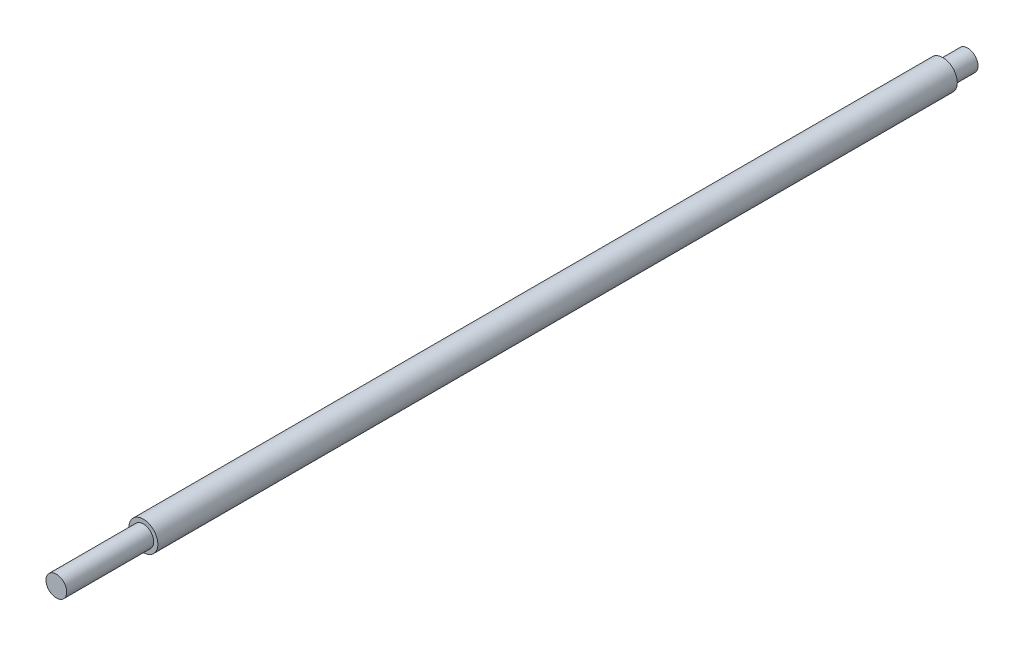
ISO-10303-21;
HEADER;
FILE_DESCRIPTION(('STEP AP214'),'2;1');
FILE_NAME('part.step','',(''),(''),'','','');
FILE_SCHEMA(('AUTOMOTIVE_DESIGN { 1 0 10303 214 1 1 1 1 }'));
ENDSEC;
DATA;
#1=APPLICATION_CONTEXT('core data for automotive mechanical design processes');
#2=APPLICATION_PROTOCOL_DEFINITION('international standard','automotive_design',2000,#1);
#3=PRODUCT_CONTEXT('',#1,'mechanical');
#4=PRODUCT('Part','Part','',(#3));
#5=PRODUCT_RELATED_PRODUCT_CATEGORY('part','',(#4));
#6=PRODUCT_DEFINITION_FORMATION('','',#4);
#7=PRODUCT_DEFINITION_CONTEXT('part definition',#1,'design');
#8=PRODUCT_DEFINITION('design','',#6,#7);
#9=PRODUCT_DEFINITION_SHAPE('','',#8);
#10=(LENGTH_UNIT() NAMED_UNIT(*) SI_UNIT(.MILLI.,.METRE.));
#11=(NAMED_UNIT(*) PLANE_ANGLE_UNIT() SI_UNIT($,.RADIAN.));
#12=(NAMED_UNIT(*) SI_UNIT($,.STERADIAN.) SOLID_ANGLE_UNIT());
#13=UNCERTAINTY_MEASURE_WITH_UNIT(LENGTH_MEASURE(1.E-05),#10,'distance_accuracy_value','');
#14=(GEOMETRIC_REPRESENTATION_CONTEXT(3) GLOBAL_UNCERTAINTY_ASSIGNED_CONTEXT((#13)) GLOBAL_UNIT_ASSIGNED_CONTEXT((#10,
#11,#12)) REPRESENTATION_CONTEXT('',''));
#15=CARTESIAN_POINT('',(0.,0.,0.));
#16=DIRECTION('',(0.,0.,1.));
#17=DIRECTION('',(1.,0.,0.));
#18=AXIS2_PLACEMENT_3D('',#15,#16,#17);
#19=CARTESIAN_POINT('',(1143.76582210559,1114.04827586898,1412.81954510621));
#20=DIRECTION('',(0.,0.,1.));
#21=DIRECTION('',(-0.582684782852807,0.812698248941006,0.));
#22=AXIS2_PLACEMENT_3D('',#19,#20,#21);
#23=PLANE('',#22);
#24=CARTESIAN_POINT('',(1143.76582210559,1114.04827586898,1412.81954510621));
#25=DIRECTION('',(0.,0.,-1.));
#26=DIRECTION('',(0.582684782852807,-0.812698248941006,0.));
#27=AXIS2_PLACEMENT_3D('',#24,#25,#26);
#28=CIRCLE('',#27,5.);
#29=CARTESIAN_POINT('',(1146.67924601985,1109.98478462427,1412.81954510621));
#30=VERTEX_POINT('',#29);
#31=EDGE_CURVE('E36',#30,#30,#28,.T.);
#32=ORIENTED_EDGE('',*,*,#31,.F.);
#33=EDGE_LOOP('',(#32));
#34=FACE_BOUND('',#33,.T.);
#35=ADVANCED_FACE('F14',(#34),#23,.T.);
#36=CARTESIAN_POINT('',(1139.70233086088,1111.13485195469,972.819545106209));
#37=DIRECTION('',(0.,0.,-1.));
#38=DIRECTION('',(0.582684782852807,-0.812698248941006,0.));
#39=AXIS2_PLACEMENT_3D('',#36,#37,#38);
#40=PLANE('',#39);
#41=CARTESIAN_POINT('',(1143.76582210559,1114.04827586896,972.819545106209));
#42=DIRECTION('',(0.,0.,-1.));
#43=DIRECTION('',(0.582684782852807,-0.812698248941006,0.));
#44=AXIS2_PLACEMENT_3D('',#41,#42,#43);
#45=CIRCLE('',#44,5.00000000000002);
#46=CARTESIAN_POINT('',(1146.67924601985,1109.98478462425,972.819545106209));
#47=VERTEX_POINT('',#46);
#48=EDGE_CURVE('E9',#47,#47,#45,.T.);
#49=ORIENTED_EDGE('',*,*,#48,.T.);
#50=EDGE_LOOP('',(#49));
#51=FACE_BOUND('',#50,.T.);
#52=ADVANCED_FACE('F44',(#51),#40,.T.);
#53=CARTESIAN_POINT('',(1143.76582210559,1114.04827586898,1412.81954510621));
#54=DIRECTION('',(0.,0.,-1.));
#55=DIRECTION('',(0.582684782852807,-0.812698248941006,0.));
#56=AXIS2_PLACEMENT_3D('',#53,#54,#55);
#57=CYLINDRICAL_SURFACE('',#56,5.00000000000002);
#58=CARTESIAN_POINT('',(1143.76582210559,1114.04827586896,984.819545106209));
#59=DIRECTION('',(0.,0.,-1.));
#60=DIRECTION('',(0.582684782852807,-0.812698248941006,0.));
#61=AXIS2_PLACEMENT_3D('',#58,#59,#60);
#62=CIRCLE('',#61,5.00000000000002);
#63=CARTESIAN_POINT('',(1146.67924601985,1109.98478462425,984.819545106209));
#64=VERTEX_POINT('',#63);
#65=EDGE_CURVE('E20',#64,#64,#62,.T.);
#66=ORIENTED_EDGE('',*,*,#65,.T.);
#67=EDGE_LOOP('',(#66));
#68=FACE_BOUND('',#67,.T.);
#69=ORIENTED_EDGE('',*,*,#48,.F.);
#70=EDGE_LOOP('',(#69));
#71=FACE_BOUND('',#70,.T.);
#72=ADVANCED_FACE('F49',(#68,#71),#57,.T.);
#73=CARTESIAN_POINT('',(1138.076934363,1109.96948238899,984.819545106209));
#74=DIRECTION('',(0.,0.,-1.));
#75=DIRECTION('',(0.582684782852807,-0.812698248941006,0.));
#76=AXIS2_PLACEMENT_3D('',#73,#74,#75);
#77=PLANE('',#76);
#78=CARTESIAN_POINT('',(1143.76582210559,1114.04827586896,984.819545106209));
#79=DIRECTION('',(0.,0.,-1.));
#80=DIRECTION('',(0.582684782852807,-0.812698248941006,0.));
#81=AXIS2_PLACEMENT_3D('',#78,#79,#80);
#82=CIRCLE('',#81,7.00000000000001);
#83=CARTESIAN_POINT('',(1147.84461558556,1108.35938812637,984.819545106209));
#84=VERTEX_POINT('',#83);
#85=EDGE_CURVE('E24',#84,#84,#82,.T.);
#86=ORIENTED_EDGE('',*,*,#85,.T.);
#87=EDGE_LOOP('',(#86));
#88=FACE_BOUND('',#87,.T.);
#89=ORIENTED_EDGE('',*,*,#65,.F.);
#90=EDGE_LOOP('',(#89));
#91=FACE_BOUND('',#90,.T.);
#92=ADVANCED_FACE('F53',(#88,#91),#77,.T.);
#93=CARTESIAN_POINT('',(1143.76582210559,1114.04827586898,1412.81954510621));
#94=DIRECTION('',(0.,0.,-1.));
#95=DIRECTION('',(0.582684782852807,-0.812698248941006,0.));
#96=AXIS2_PLACEMENT_3D('',#93,#94,#95);
#97=CYLINDRICAL_SURFACE('',#96,7.00000000000001);
#98=CARTESIAN_POINT('',(1143.76582210559,1114.04827586897,1370.81954510621));
#99=DIRECTION('',(0.,0.,-1.));
#100=DIRECTION('',(0.582684782852807,-0.812698248941006,0.));
#101=AXIS2_PLACEMENT_3D('',#98,#99,#100);
#102=CIRCLE('',#101,7.00000000000001);
#103=CARTESIAN_POINT('',(1147.84461558556,1108.35938812639,1370.81954510621));
#104=VERTEX_POINT('',#103);
#105=EDGE_CURVE('E28',#104,#104,#102,.T.);
#106=ORIENTED_EDGE('',*,*,#105,.T.);
#107=EDGE_LOOP('',(#106));
#108=FACE_BOUND('',#107,.T.);
#109=ORIENTED_EDGE('',*,*,#85,.F.);
#110=EDGE_LOOP('',(#109));
#111=FACE_BOUND('',#110,.T.);
#112=ADVANCED_FACE('F58',(#108,#111),#97,.T.);
#113=CARTESIAN_POINT('',(1139.70233086088,1111.13485195471,1370.81954510621));
#114=DIRECTION('',(0.,0.,1.));
#115=DIRECTION('',(-0.582684782852807,0.812698248941006,0.));
#116=AXIS2_PLACEMENT_3D('',#113,#114,#115);
#117=PLANE('',#116);
#118=CARTESIAN_POINT('',(1143.76582210559,1114.04827586897,1370.81954510621));
#119=DIRECTION('',(0.,0.,-1.));
#120=DIRECTION('',(0.582684782852807,-0.812698248941006,0.));
#121=AXIS2_PLACEMENT_3D('',#118,#119,#120);
#122=CIRCLE('',#121,5.00000000000001);
#123=CARTESIAN_POINT('',(1146.67924601985,1109.98478462427,1370.81954510621));
#124=VERTEX_POINT('',#123);
#125=EDGE_CURVE('E33',#124,#124,#122,.T.);
#126=ORIENTED_EDGE('',*,*,#125,.T.);
#127=EDGE_LOOP('',(#126));
#128=FACE_BOUND('',#127,.T.);
#129=ORIENTED_EDGE('',*,*,#105,.F.);
#130=EDGE_LOOP('',(#129));
#131=FACE_BOUND('',#130,.T.);
#132=ADVANCED_FACE('F62',(#128,#131),#117,.T.);
#133=CARTESIAN_POINT('',(1143.76582210559,1114.04827586898,1412.81954510621));
#134=DIRECTION('',(0.,0.,-1.));
#135=DIRECTION('',(0.582684782852807,-0.812698248941006,0.));
#136=AXIS2_PLACEMENT_3D('',#133,#134,#135);
#137=CYLINDRICAL_SURFACE('',#136,5.);
#138=ORIENTED_EDGE('',*,*,#31,.T.);
#139=EDGE_LOOP('',(#138));
#140=FACE_BOUND('',#139,.T.);
#141=ORIENTED_EDGE('',*,*,#125,.F.);
#142=EDGE_LOOP('',(#141));
#143=FACE_BOUND('',#142,.T.);
#144=ADVANCED_FACE('F40',(#140,#143),#137,.T.);
#145=CLOSED_SHELL('',(#35,#52,#72,#92,#112,#132,#144));
#146=MANIFOLD_SOLID_BREP('B1',#145);
#147=ADVANCED_BREP_SHAPE_REPRESENTATION('',(#18,#146),#14);
#148=SHAPE_DEFINITION_REPRESENTATION(#9,#147);
ENDSEC;
END-ISO-10303-21;
